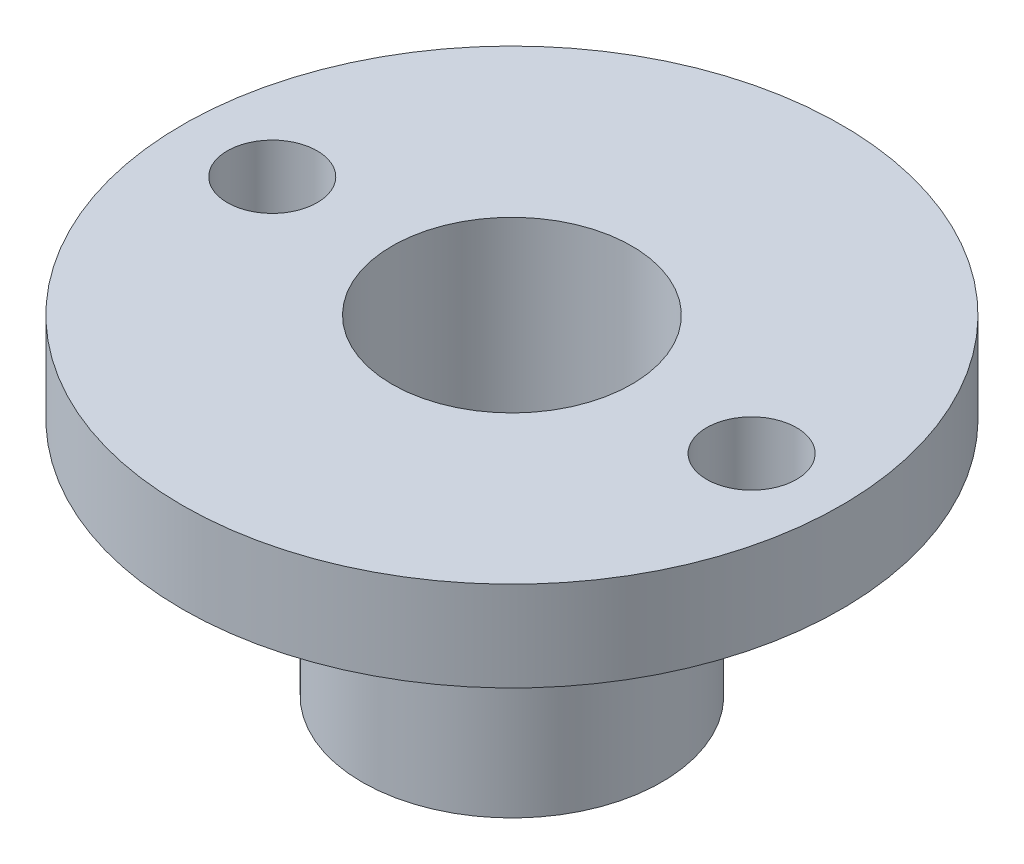
ISO-10303-21;
HEADER;
FILE_DESCRIPTION(('STEP AP214'),'2;1');
FILE_NAME('part.step','',(''),(''),'','','');
FILE_SCHEMA(('AUTOMOTIVE_DESIGN { 1 0 10303 214 1 1 1 1 }'));
ENDSEC;
DATA;
#1=APPLICATION_CONTEXT('core data for automotive mechanical design processes');
#2=APPLICATION_PROTOCOL_DEFINITION('international standard','automotive_design',2000,#1);
#3=PRODUCT_CONTEXT('',#1,'mechanical');
#4=PRODUCT('Part','Part','',(#3));
#5=PRODUCT_RELATED_PRODUCT_CATEGORY('part','',(#4));
#6=PRODUCT_DEFINITION_FORMATION('','',#4);
#7=PRODUCT_DEFINITION_CONTEXT('part definition',#1,'design');
#8=PRODUCT_DEFINITION('design','',#6,#7);
#9=PRODUCT_DEFINITION_SHAPE('','',#8);
#10=(LENGTH_UNIT() NAMED_UNIT(*) SI_UNIT(.MILLI.,.METRE.));
#11=(NAMED_UNIT(*) PLANE_ANGLE_UNIT() SI_UNIT($,.RADIAN.));
#12=(NAMED_UNIT(*) SI_UNIT($,.STERADIAN.) SOLID_ANGLE_UNIT());
#13=UNCERTAINTY_MEASURE_WITH_UNIT(LENGTH_MEASURE(1.E-05),#10,'distance_accuracy_value','');
#14=(GEOMETRIC_REPRESENTATION_CONTEXT(3) GLOBAL_UNCERTAINTY_ASSIGNED_CONTEXT((#13)) GLOBAL_UNIT_ASSIGNED_CONTEXT((#10,
#11,#12)) REPRESENTATION_CONTEXT('',''));
#15=CARTESIAN_POINT('',(0.,0.,0.));
#16=DIRECTION('',(0.,0.,1.));
#17=DIRECTION('',(1.,0.,0.));
#18=AXIS2_PLACEMENT_3D('',#15,#16,#17);
#19=CARTESIAN_POINT('',(0.,0.,0.));
#20=DIRECTION('',(0.,1.,0.));
#21=DIRECTION('',(0.,0.,1.));
#22=AXIS2_PLACEMENT_3D('',#19,#20,#21);
#23=PLANE('',#22);
#24=CARTESIAN_POINT('',(0.,0.,0.));
#25=DIRECTION('',(0.,1.,0.));
#26=DIRECTION('',(0.,0.,1.));
#27=AXIS2_PLACEMENT_3D('',#24,#25,#26);
#28=CIRCLE('',#27,5.);
#29=CARTESIAN_POINT('',(0.,0.,5.));
#30=VERTEX_POINT('',#29);
#31=EDGE_CURVE('E36',#30,#30,#28,.T.);
#32=ORIENTED_EDGE('',*,*,#31,.F.);
#33=EDGE_LOOP('',(#32));
#34=FACE_BOUND('',#33,.T.);
#35=CARTESIAN_POINT('',(0.,0.,0.));
#36=DIRECTION('',(0.,1.,0.));
#37=DIRECTION('',(0.,0.,1.));
#38=AXIS2_PLACEMENT_3D('',#35,#36,#37);
#39=CIRCLE('',#38,4.);
#40=CARTESIAN_POINT('',(0.,0.,4.));
#41=VERTEX_POINT('',#40);
#42=EDGE_CURVE('E43',#41,#41,#39,.T.);
#43=ORIENTED_EDGE('',*,*,#42,.T.);
#44=EDGE_LOOP('',(#43));
#45=FACE_BOUND('',#44,.T.);
#46=ADVANCED_FACE('F32',(#34,#45),#23,.F.);
#47=CARTESIAN_POINT('',(0.,8.,0.));
#48=DIRECTION('',(0.,-1.,0.));
#49=DIRECTION('',(0.,0.,-1.));
#50=AXIS2_PLACEMENT_3D('',#47,#48,#49);
#51=CYLINDRICAL_SURFACE('',#50,5.);
#52=CARTESIAN_POINT('',(0.,8.,0.));
#53=DIRECTION('',(0.,1.,0.));
#54=DIRECTION('',(0.,0.,1.));
#55=AXIS2_PLACEMENT_3D('',#52,#53,#54);
#56=CIRCLE('',#55,5.);
#57=CARTESIAN_POINT('',(0.,8.,5.));
#58=VERTEX_POINT('',#57);
#59=EDGE_CURVE('E10',#58,#58,#56,.T.);
#60=ORIENTED_EDGE('',*,*,#59,.F.);
#61=EDGE_LOOP('',(#60));
#62=FACE_BOUND('',#61,.T.);
#63=ORIENTED_EDGE('',*,*,#31,.T.);
#64=EDGE_LOOP('',(#63));
#65=FACE_BOUND('',#64,.T.);
#66=ADVANCED_FACE('F34',(#62,#65),#51,.T.);
#67=CARTESIAN_POINT('',(0.,8.,0.));
#68=DIRECTION('',(0.,-1.,0.));
#69=DIRECTION('',(0.,0.,-1.));
#70=AXIS2_PLACEMENT_3D('',#67,#68,#69);
#71=CYLINDRICAL_SURFACE('',#70,4.);
#72=ORIENTED_EDGE('',*,*,#42,.F.);
#73=EDGE_LOOP('',(#72));
#74=FACE_BOUND('',#73,.T.);
#75=CARTESIAN_POINT('',(0.,11.,0.));
#76=DIRECTION('',(0.,1.,0.));
#77=DIRECTION('',(0.,0.,1.));
#78=AXIS2_PLACEMENT_3D('',#75,#76,#77);
#79=CIRCLE('',#78,4.);
#80=CARTESIAN_POINT('',(0.,11.,4.));
#81=VERTEX_POINT('',#80);
#82=EDGE_CURVE('E51',#81,#81,#79,.T.);
#83=ORIENTED_EDGE('',*,*,#82,.T.);
#84=EDGE_LOOP('',(#83));
#85=FACE_BOUND('',#84,.T.);
#86=ADVANCED_FACE('F75',(#74,#85),#71,.F.);
#87=CARTESIAN_POINT('',(0.,11.,0.));
#88=DIRECTION('',(0.,1.,0.));
#89=DIRECTION('',(0.,0.,1.));
#90=AXIS2_PLACEMENT_3D('',#87,#88,#89);
#91=PLANE('',#90);
#92=CARTESIAN_POINT('',(8.,11.,0.));
#93=DIRECTION('',(0.,1.,0.));
#94=DIRECTION('',(0.,0.,1.));
#95=AXIS2_PLACEMENT_3D('',#92,#93,#94);
#96=CIRCLE('',#95,1.5);
#97=CARTESIAN_POINT('',(8.,11.,1.5));
#98=VERTEX_POINT('',#97);
#99=EDGE_CURVE('E60',#98,#98,#96,.T.);
#100=ORIENTED_EDGE('',*,*,#99,.F.);
#101=EDGE_LOOP('',(#100));
#102=FACE_BOUND('',#101,.T.);
#103=CARTESIAN_POINT('',(-8.,11.,0.));
#104=DIRECTION('',(0.,1.,0.));
#105=DIRECTION('',(0.,0.,1.));
#106=AXIS2_PLACEMENT_3D('',#103,#104,#105);
#107=CIRCLE('',#106,1.5);
#108=CARTESIAN_POINT('',(-8.,11.,1.5));
#109=VERTEX_POINT('',#108);
#110=EDGE_CURVE('E57',#109,#109,#107,.T.);
#111=ORIENTED_EDGE('',*,*,#110,.F.);
#112=EDGE_LOOP('',(#111));
#113=FACE_BOUND('',#112,.T.);
#114=CARTESIAN_POINT('',(0.,11.,0.));
#115=DIRECTION('',(0.,1.,0.));
#116=DIRECTION('',(0.,0.,1.));
#117=AXIS2_PLACEMENT_3D('',#114,#115,#116);
#118=CIRCLE('',#117,11.);
#119=CARTESIAN_POINT('',(0.,11.,11.));
#120=VERTEX_POINT('',#119);
#121=EDGE_CURVE('E47',#120,#120,#118,.T.);
#122=ORIENTED_EDGE('',*,*,#121,.T.);
#123=EDGE_LOOP('',(#122));
#124=FACE_BOUND('',#123,.T.);
#125=ORIENTED_EDGE('',*,*,#82,.F.);
#126=EDGE_LOOP('',(#125));
#127=FACE_BOUND('',#126,.T.);
#128=ADVANCED_FACE('F71',(#102,#113,#124,#127),#91,.T.);
#129=CARTESIAN_POINT('',(0.,8.,0.));
#130=DIRECTION('',(0.,1.,0.));
#131=DIRECTION('',(0.,0.,1.));
#132=AXIS2_PLACEMENT_3D('',#129,#130,#131);
#133=PLANE('',#132);
#134=CARTESIAN_POINT('',(8.,8.,0.));
#135=DIRECTION('',(0.,1.,0.));
#136=DIRECTION('',(0.,0.,1.));
#137=AXIS2_PLACEMENT_3D('',#134,#135,#136);
#138=CIRCLE('',#137,1.5);
#139=CARTESIAN_POINT('',(8.,8.,1.5));
#140=VERTEX_POINT('',#139);
#141=EDGE_CURVE('E56',#140,#140,#138,.F.);
#142=ORIENTED_EDGE('',*,*,#141,.F.);
#143=EDGE_LOOP('',(#142));
#144=FACE_BOUND('',#143,.T.);
#145=CARTESIAN_POINT('',(-8.,8.,0.));
#146=DIRECTION('',(0.,1.,0.));
#147=DIRECTION('',(0.,0.,1.));
#148=AXIS2_PLACEMENT_3D('',#145,#146,#147);
#149=CIRCLE('',#148,1.5);
#150=CARTESIAN_POINT('',(-8.,8.,1.5));
#151=VERTEX_POINT('',#150);
#152=EDGE_CURVE('E61',#151,#151,#149,.F.);
#153=ORIENTED_EDGE('',*,*,#152,.F.);
#154=EDGE_LOOP('',(#153));
#155=FACE_BOUND('',#154,.T.);
#156=ORIENTED_EDGE('',*,*,#59,.T.);
#157=EDGE_LOOP('',(#156));
#158=FACE_BOUND('',#157,.T.);
#159=CARTESIAN_POINT('',(0.,8.,0.));
#160=DIRECTION('',(0.,1.,0.));
#161=DIRECTION('',(0.,0.,1.));
#162=AXIS2_PLACEMENT_3D('',#159,#160,#161);
#163=CIRCLE('',#162,11.);
#164=CARTESIAN_POINT('',(0.,8.,11.));
#165=VERTEX_POINT('',#164);
#166=EDGE_CURVE('E48',#165,#165,#163,.T.);
#167=ORIENTED_EDGE('',*,*,#166,.F.);
#168=EDGE_LOOP('',(#167));
#169=FACE_BOUND('',#168,.T.);
#170=ADVANCED_FACE('F74',(#144,#155,#158,#169),#133,.F.);
#171=CARTESIAN_POINT('',(0.,11.,0.));
#172=DIRECTION('',(0.,-1.,0.));
#173=DIRECTION('',(0.,0.,-1.));
#174=AXIS2_PLACEMENT_3D('',#171,#172,#173);
#175=CYLINDRICAL_SURFACE('',#174,11.);
#176=ORIENTED_EDGE('',*,*,#121,.F.);
#177=EDGE_LOOP('',(#176));
#178=FACE_BOUND('',#177,.T.);
#179=ORIENTED_EDGE('',*,*,#166,.T.);
#180=EDGE_LOOP('',(#179));
#181=FACE_BOUND('',#180,.T.);
#182=ADVANCED_FACE('F114',(#178,#181),#175,.T.);
#183=CARTESIAN_POINT('',(-8.,3.75735931288072,0.));
#184=DIRECTION('',(0.,1.,0.));
#185=DIRECTION('',(0.,0.,1.));
#186=AXIS2_PLACEMENT_3D('',#183,#184,#185);
#187=CYLINDRICAL_SURFACE('',#186,1.5);
#188=CARTESIAN_POINT('',(-8.,8.,1.5));
#189=CARTESIAN_POINT('',(-8.,8.03125,1.5));
#190=CARTESIAN_POINT('',(-8.,8.0625,1.5));
#191=CARTESIAN_POINT('',(-8.,8.125,1.5));
#192=CARTESIAN_POINT('',(-8.,8.15625,1.5));
#193=CARTESIAN_POINT('',(-8.,8.21875,1.5));
#194=CARTESIAN_POINT('',(-8.,8.25,1.5));
#195=CARTESIAN_POINT('',(-8.,8.3125,1.5));
#196=CARTESIAN_POINT('',(-8.,8.34375,1.5));
#197=CARTESIAN_POINT('',(-8.,8.40625,1.5));
#198=CARTESIAN_POINT('',(-8.,8.4375,1.5));
#199=CARTESIAN_POINT('',(-8.,8.5,1.5));
#200=CARTESIAN_POINT('',(-8.,8.53125,1.5));
#201=CARTESIAN_POINT('',(-8.,8.59375,1.5));
#202=CARTESIAN_POINT('',(-8.,8.625,1.5));
#203=CARTESIAN_POINT('',(-8.,8.6875,1.5));
#204=CARTESIAN_POINT('',(-8.,8.71875,1.5));
#205=CARTESIAN_POINT('',(-8.,8.78125,1.5));
#206=CARTESIAN_POINT('',(-8.,8.8125,1.5));
#207=CARTESIAN_POINT('',(-8.,8.875,1.5));
#208=CARTESIAN_POINT('',(-8.,8.90625,1.5));
#209=CARTESIAN_POINT('',(-8.,8.96875,1.5));
#210=CARTESIAN_POINT('',(-8.,9.,1.5));
#211=CARTESIAN_POINT('',(-8.,9.0625,1.5));
#212=CARTESIAN_POINT('',(-8.,9.09375,1.5));
#213=CARTESIAN_POINT('',(-8.,9.15625,1.5));
#214=CARTESIAN_POINT('',(-8.,9.1875,1.5));
#215=CARTESIAN_POINT('',(-8.,9.25,1.5));
#216=CARTESIAN_POINT('',(-8.,9.28125,1.5));
#217=CARTESIAN_POINT('',(-8.,9.34375,1.5));
#218=CARTESIAN_POINT('',(-8.,9.375,1.5));
#219=CARTESIAN_POINT('',(-8.,9.4375,1.5));
#220=CARTESIAN_POINT('',(-8.,9.46875,1.5));
#221=CARTESIAN_POINT('',(-8.,9.53125,1.5));
#222=CARTESIAN_POINT('',(-8.,9.5625,1.5));
#223=CARTESIAN_POINT('',(-8.,9.625,1.5));
#224=CARTESIAN_POINT('',(-8.,9.65625,1.5));
#225=CARTESIAN_POINT('',(-8.,9.71875,1.5));
#226=CARTESIAN_POINT('',(-8.,9.75,1.5));
#227=CARTESIAN_POINT('',(-8.,9.8125,1.5));
#228=CARTESIAN_POINT('',(-8.,9.84375,1.5));
#229=CARTESIAN_POINT('',(-8.,9.90625,1.5));
#230=CARTESIAN_POINT('',(-8.,9.9375,1.5));
#231=CARTESIAN_POINT('',(-8.,10.,1.5));
#232=CARTESIAN_POINT('',(-8.,10.03125,1.5));
#233=CARTESIAN_POINT('',(-8.,10.09375,1.5));
#234=CARTESIAN_POINT('',(-8.,10.125,1.5));
#235=CARTESIAN_POINT('',(-8.,10.1875,1.5));
#236=CARTESIAN_POINT('',(-8.,10.21875,1.5));
#237=CARTESIAN_POINT('',(-8.,10.28125,1.5));
#238=CARTESIAN_POINT('',(-8.,10.3125,1.5));
#239=CARTESIAN_POINT('',(-8.,10.375,1.5));
#240=CARTESIAN_POINT('',(-8.,10.40625,1.5));
#241=CARTESIAN_POINT('',(-8.,10.46875,1.5));
#242=CARTESIAN_POINT('',(-8.,10.5,1.5));
#243=CARTESIAN_POINT('',(-8.,10.5625,1.5));
#244=CARTESIAN_POINT('',(-8.,10.59375,1.5));
#245=CARTESIAN_POINT('',(-8.,10.65625,1.5));
#246=CARTESIAN_POINT('',(-8.,10.6875,1.5));
#247=CARTESIAN_POINT('',(-8.,10.75,1.5));
#248=CARTESIAN_POINT('',(-8.,10.78125,1.5));
#249=CARTESIAN_POINT('',(-8.,10.84375,1.5));
#250=CARTESIAN_POINT('',(-8.,10.875,1.5));
#251=CARTESIAN_POINT('',(-8.,10.9375,1.5));
#252=CARTESIAN_POINT('',(-8.,10.96875,1.5));
#253=CARTESIAN_POINT('',(-8.,11.,1.5));
#254=B_SPLINE_CURVE_WITH_KNOTS('',3,(#188,#189,#190,#191,#192,#193,#194,#195,#196,#197,#198,
#199,#200,#201,#202,#203,#204,#205,#206,#207,#208,#209,#210,#211,#212,#213,#214,#215,#216,#217,
#218,#219,#220,#221,#222,#223,#224,#225,#226,#227,#228,#229,#230,#231,#232,#233,#234,#235,#236,
#237,#238,#239,#240,#241,#242,#243,#244,#245,#246,#247,#248,#249,#250,#251,#252,#253),
.UNSPECIFIED.,.F.,.F.,(4,2,2,2,2,2,2,2,2,2,2,2,2,2,2,2,2,2,2,2,2,2,2,2,2,2,2,2,2,2,2,2,4),(0.,
0.0937500000000001,0.1875,0.28125,0.375,0.468749999999999,0.562499999999999,0.656249999999999,
0.749999999999999,0.843749999999999,0.937499999999999,1.03125,1.125,1.21875,1.3125,1.40625,1.5,
1.59375,1.6875,1.78125,1.875,1.96875,2.0625,2.15625,2.25,2.34375,2.4375,2.53125,2.625,2.71875,
2.8125,2.90625,3.),.UNSPECIFIED.);
#255=EDGE_CURVE('BSEAM119',#151,#109,#254,.T.);
#256=ORIENTED_EDGE('',*,*,#152,.T.);
#257=ORIENTED_EDGE('',*,*,#110,.T.);
#258=ORIENTED_EDGE('',*,*,#255,.T.);
#259=ORIENTED_EDGE('',*,*,#255,.F.);
#260=EDGE_LOOP('',(#256,#258,#257,#259));
#261=FACE_BOUND('',#260,.T.);
#262=ADVANCED_FACE('F119',(#261),#187,.F.);
#263=CARTESIAN_POINT('',(8.,3.75735931288072,0.));
#264=DIRECTION('',(0.,1.,0.));
#265=DIRECTION('',(0.,0.,1.));
#266=AXIS2_PLACEMENT_3D('',#263,#264,#265);
#267=CYLINDRICAL_SURFACE('',#266,1.5);
#268=CARTESIAN_POINT('',(8.,8.,1.5));
#269=CARTESIAN_POINT('',(8.,8.03125,1.5));
#270=CARTESIAN_POINT('',(8.,8.0625,1.5));
#271=CARTESIAN_POINT('',(8.,8.125,1.5));
#272=CARTESIAN_POINT('',(8.,8.15625,1.5));
#273=CARTESIAN_POINT('',(8.,8.21875,1.5));
#274=CARTESIAN_POINT('',(8.,8.25,1.5));
#275=CARTESIAN_POINT('',(8.,8.3125,1.5));
#276=CARTESIAN_POINT('',(8.,8.34375,1.5));
#277=CARTESIAN_POINT('',(8.,8.40625,1.5));
#278=CARTESIAN_POINT('',(8.,8.4375,1.5));
#279=CARTESIAN_POINT('',(8.,8.5,1.5));
#280=CARTESIAN_POINT('',(8.,8.53125,1.5));
#281=CARTESIAN_POINT('',(8.,8.59375,1.5));
#282=CARTESIAN_POINT('',(8.,8.625,1.5));
#283=CARTESIAN_POINT('',(8.,8.6875,1.5));
#284=CARTESIAN_POINT('',(8.,8.71875,1.5));
#285=CARTESIAN_POINT('',(8.,8.78125,1.5));
#286=CARTESIAN_POINT('',(8.,8.8125,1.5));
#287=CARTESIAN_POINT('',(8.,8.875,1.5));
#288=CARTESIAN_POINT('',(8.,8.90625,1.5));
#289=CARTESIAN_POINT('',(8.,8.96875,1.5));
#290=CARTESIAN_POINT('',(8.,9.,1.5));
#291=CARTESIAN_POINT('',(8.,9.0625,1.5));
#292=CARTESIAN_POINT('',(8.,9.09375,1.5));
#293=CARTESIAN_POINT('',(8.,9.15625,1.5));
#294=CARTESIAN_POINT('',(8.,9.1875,1.5));
#295=CARTESIAN_POINT('',(8.,9.25,1.5));
#296=CARTESIAN_POINT('',(8.,9.28125,1.5));
#297=CARTESIAN_POINT('',(8.,9.34375,1.5));
#298=CARTESIAN_POINT('',(8.,9.375,1.5));
#299=CARTESIAN_POINT('',(8.,9.4375,1.5));
#300=CARTESIAN_POINT('',(8.,9.46875,1.5));
#301=CARTESIAN_POINT('',(8.,9.53125,1.5));
#302=CARTESIAN_POINT('',(8.,9.5625,1.5));
#303=CARTESIAN_POINT('',(8.,9.625,1.5));
#304=CARTESIAN_POINT('',(8.,9.65625,1.5));
#305=CARTESIAN_POINT('',(8.,9.71875,1.5));
#306=CARTESIAN_POINT('',(8.,9.75,1.5));
#307=CARTESIAN_POINT('',(8.,9.8125,1.5));
#308=CARTESIAN_POINT('',(8.,9.84375,1.5));
#309=CARTESIAN_POINT('',(8.,9.90625,1.5));
#310=CARTESIAN_POINT('',(8.,9.9375,1.5));
#311=CARTESIAN_POINT('',(8.,10.,1.5));
#312=CARTESIAN_POINT('',(8.,10.03125,1.5));
#313=CARTESIAN_POINT('',(8.,10.09375,1.5));
#314=CARTESIAN_POINT('',(8.,10.125,1.5));
#315=CARTESIAN_POINT('',(8.,10.1875,1.5));
#316=CARTESIAN_POINT('',(8.,10.21875,1.5));
#317=CARTESIAN_POINT('',(8.,10.28125,1.5));
#318=CARTESIAN_POINT('',(8.,10.3125,1.5));
#319=CARTESIAN_POINT('',(8.,10.375,1.5));
#320=CARTESIAN_POINT('',(8.,10.40625,1.5));
#321=CARTESIAN_POINT('',(8.,10.46875,1.5));
#322=CARTESIAN_POINT('',(8.,10.5,1.5));
#323=CARTESIAN_POINT('',(8.,10.5625,1.5));
#324=CARTESIAN_POINT('',(8.,10.59375,1.5));
#325=CARTESIAN_POINT('',(8.,10.65625,1.5));
#326=CARTESIAN_POINT('',(8.,10.6875,1.5));
#327=CARTESIAN_POINT('',(8.,10.75,1.5));
#328=CARTESIAN_POINT('',(8.,10.78125,1.5));
#329=CARTESIAN_POINT('',(8.,10.84375,1.5));
#330=CARTESIAN_POINT('',(8.,10.875,1.5));
#331=CARTESIAN_POINT('',(8.,10.9375,1.5));
#332=CARTESIAN_POINT('',(8.,10.96875,1.5));
#333=CARTESIAN_POINT('',(8.,11.,1.5));
#334=B_SPLINE_CURVE_WITH_KNOTS('',3,(#268,#269,#270,#271,#272,#273,#274,#275,#276,#277,#278,
#279,#280,#281,#282,#283,#284,#285,#286,#287,#288,#289,#290,#291,#292,#293,#294,#295,#296,#297,
#298,#299,#300,#301,#302,#303,#304,#305,#306,#307,#308,#309,#310,#311,#312,#313,#314,#315,#316,
#317,#318,#319,#320,#321,#322,#323,#324,#325,#326,#327,#328,#329,#330,#331,#332,#333),
.UNSPECIFIED.,.F.,.F.,(4,2,2,2,2,2,2,2,2,2,2,2,2,2,2,2,2,2,2,2,2,2,2,2,2,2,2,2,2,2,2,2,4),(0.,
0.0937500000000001,0.1875,0.28125,0.375,0.468749999999999,0.562499999999999,0.656249999999999,
0.749999999999999,0.843749999999999,0.937499999999999,1.03125,1.125,1.21875,1.3125,1.40625,1.5,
1.59375,1.6875,1.78125,1.875,1.96875,2.0625,2.15625,2.25,2.34375,2.4375,2.53125,2.625,2.71875,
2.8125,2.90625,3.),.UNSPECIFIED.);
#335=EDGE_CURVE('BSEAM69',#140,#98,#334,.T.);
#336=ORIENTED_EDGE('',*,*,#141,.T.);
#337=ORIENTED_EDGE('',*,*,#99,.T.);
#338=ORIENTED_EDGE('',*,*,#335,.T.);
#339=ORIENTED_EDGE('',*,*,#335,.F.);
#340=EDGE_LOOP('',(#336,#338,#337,#339));
#341=FACE_BOUND('',#340,.T.);
#342=ADVANCED_FACE('F69',(#341),#267,.F.);
#343=CLOSED_SHELL('',(#46,#66,#86,#128,#170,#182,#262,#342));
#344=MANIFOLD_SOLID_BREP('B2',#343);
#345=ADVANCED_BREP_SHAPE_REPRESENTATION('',(#18,#344),#14);
#346=SHAPE_DEFINITION_REPRESENTATION(#9,#345);
ENDSEC;
END-ISO-10303-21;
